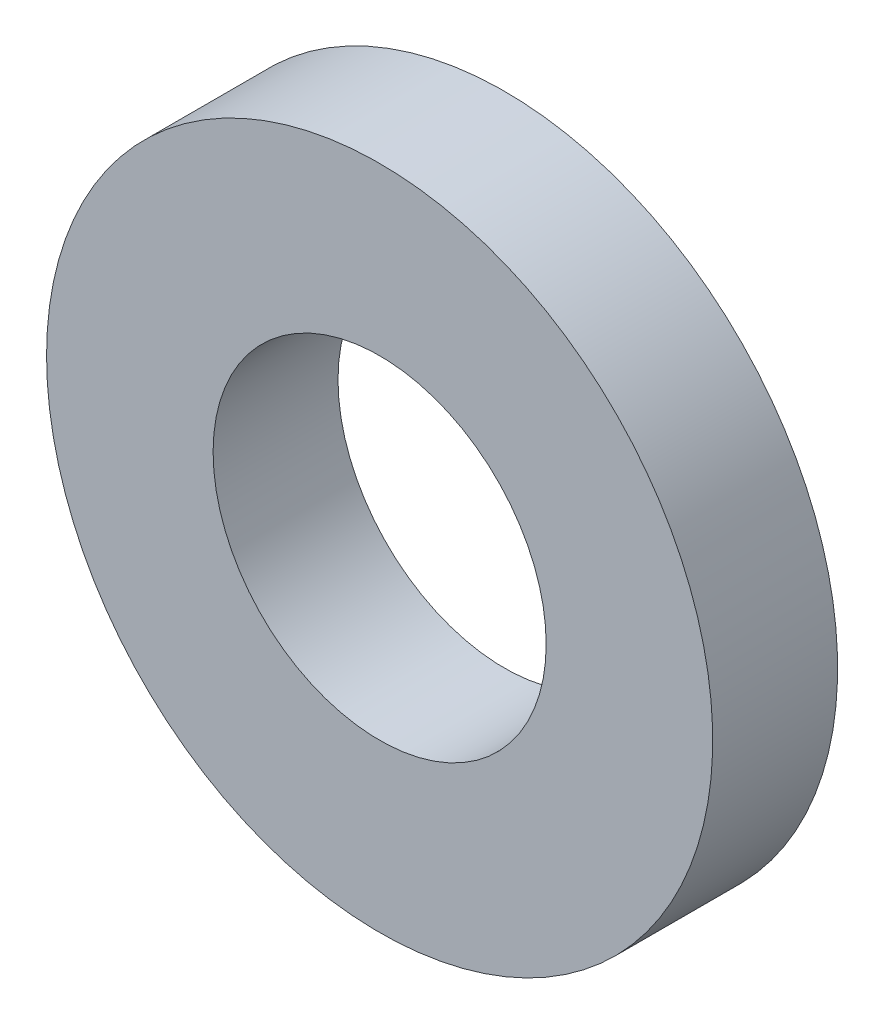
ISO-10303-21;
HEADER;
FILE_DESCRIPTION(('STEP AP214'),'2;1');
FILE_NAME('part.step','',(''),(''),'','','');
FILE_SCHEMA(('AUTOMOTIVE_DESIGN { 1 0 10303 214 1 1 1 1 }'));
ENDSEC;
DATA;
#1=APPLICATION_CONTEXT('core data for automotive mechanical design processes');
#2=APPLICATION_PROTOCOL_DEFINITION('international standard','automotive_design',2000,#1);
#3=PRODUCT_CONTEXT('',#1,'mechanical');
#4=PRODUCT('Part','Part','',(#3));
#5=PRODUCT_RELATED_PRODUCT_CATEGORY('part','',(#4));
#6=PRODUCT_DEFINITION_FORMATION('','',#4);
#7=PRODUCT_DEFINITION_CONTEXT('part definition',#1,'design');
#8=PRODUCT_DEFINITION('design','',#6,#7);
#9=PRODUCT_DEFINITION_SHAPE('','',#8);
#10=(LENGTH_UNIT() NAMED_UNIT(*) SI_UNIT(.MILLI.,.METRE.));
#11=(NAMED_UNIT(*) PLANE_ANGLE_UNIT() SI_UNIT($,.RADIAN.));
#12=(NAMED_UNIT(*) SI_UNIT($,.STERADIAN.) SOLID_ANGLE_UNIT());
#13=UNCERTAINTY_MEASURE_WITH_UNIT(LENGTH_MEASURE(1.E-05),#10,'distance_accuracy_value','');
#14=(GEOMETRIC_REPRESENTATION_CONTEXT(3) GLOBAL_UNCERTAINTY_ASSIGNED_CONTEXT((#13)) GLOBAL_UNIT_ASSIGNED_CONTEXT((#10,
#11,#12)) REPRESENTATION_CONTEXT('',''));
#15=CARTESIAN_POINT('',(0.,0.,0.));
#16=DIRECTION('',(0.,0.,1.));
#17=DIRECTION('',(1.,0.,0.));
#18=AXIS2_PLACEMENT_3D('',#15,#16,#17);
#19=CARTESIAN_POINT('',(0.,0.,2.38125));
#20=DIRECTION('',(0.,0.,1.));
#21=DIRECTION('',(1.,0.,0.));
#22=AXIS2_PLACEMENT_3D('',#19,#20,#21);
#23=PLANE('',#22);
#24=CARTESIAN_POINT('',(0.,0.,2.38125));
#25=DIRECTION('',(0.,0.,1.));
#26=DIRECTION('',(1.,0.,0.));
#27=AXIS2_PLACEMENT_3D('',#24,#25,#26);
#28=CIRCLE('',#27,12.7);
#29=CARTESIAN_POINT('',(-12.7,0.,2.38125));
#30=VERTEX_POINT('',#29);
#31=EDGE_CURVE('E10',#30,#30,#28,.T.);
#32=ORIENTED_EDGE('',*,*,#31,.T.);
#33=EDGE_LOOP('',(#32));
#34=FACE_BOUND('',#33,.T.);
#35=CARTESIAN_POINT('',(0.,0.,2.38125));
#36=DIRECTION('',(0.,0.,1.));
#37=DIRECTION('',(1.,0.,0.));
#38=AXIS2_PLACEMENT_3D('',#35,#36,#37);
#39=CIRCLE('',#38,6.35);
#40=CARTESIAN_POINT('',(-6.35,0.,2.38125));
#41=VERTEX_POINT('',#40);
#42=EDGE_CURVE('E54',#41,#41,#39,.T.);
#43=ORIENTED_EDGE('',*,*,#42,.F.);
#44=EDGE_LOOP('',(#43));
#45=FACE_BOUND('',#44,.T.);
#46=ADVANCED_FACE('F41',(#34,#45),#23,.T.);
#47=CARTESIAN_POINT('',(0.,0.,-2.38125));
#48=DIRECTION('',(0.,0.,1.));
#49=DIRECTION('',(1.,0.,0.));
#50=AXIS2_PLACEMENT_3D('',#47,#48,#49);
#51=PLANE('',#50);
#52=CARTESIAN_POINT('',(0.,0.,-2.38125));
#53=DIRECTION('',(0.,0.,1.));
#54=DIRECTION('',(1.,0.,0.));
#55=AXIS2_PLACEMENT_3D('',#52,#53,#54);
#56=CIRCLE('',#55,12.7);
#57=CARTESIAN_POINT('',(-12.7,0.,-2.38125));
#58=VERTEX_POINT('',#57);
#59=EDGE_CURVE('E45',#58,#58,#56,.T.);
#60=ORIENTED_EDGE('',*,*,#59,.F.);
#61=EDGE_LOOP('',(#60));
#62=FACE_BOUND('',#61,.T.);
#63=CARTESIAN_POINT('',(0.,0.,-2.38125));
#64=DIRECTION('',(0.,0.,1.));
#65=DIRECTION('',(1.,0.,0.));
#66=AXIS2_PLACEMENT_3D('',#63,#64,#65);
#67=CIRCLE('',#66,6.35);
#68=CARTESIAN_POINT('',(-6.35,0.,-2.38125));
#69=VERTEX_POINT('',#68);
#70=EDGE_CURVE('E56',#69,#69,#67,.T.);
#71=ORIENTED_EDGE('',*,*,#70,.T.);
#72=EDGE_LOOP('',(#71));
#73=FACE_BOUND('',#72,.T.);
#74=ADVANCED_FACE('F68',(#62,#73),#51,.F.);
#75=CARTESIAN_POINT('',(0.,0.,2.38125));
#76=DIRECTION('',(0.,0.,-1.));
#77=DIRECTION('',(-1.,0.,0.));
#78=AXIS2_PLACEMENT_3D('',#75,#76,#77);
#79=CYLINDRICAL_SURFACE('',#78,12.7);
#80=CARTESIAN_POINT('',(-12.7,0.,2.38125));
#81=CARTESIAN_POINT('',(-12.7,0.,2.331640625));
#82=CARTESIAN_POINT('',(-12.7,0.,2.28203125));
#83=CARTESIAN_POINT('',(-12.7,0.,2.1828125));
#84=CARTESIAN_POINT('',(-12.7,0.,2.133203125));
#85=CARTESIAN_POINT('',(-12.7,0.,2.033984375));
#86=CARTESIAN_POINT('',(-12.7,0.,1.984375));
#87=CARTESIAN_POINT('',(-12.7,0.,1.88515625));
#88=CARTESIAN_POINT('',(-12.7,0.,1.835546875));
#89=CARTESIAN_POINT('',(-12.7,0.,1.736328125));
#90=CARTESIAN_POINT('',(-12.7,0.,1.68671875));
#91=CARTESIAN_POINT('',(-12.7,0.,1.5875));
#92=CARTESIAN_POINT('',(-12.7,0.,1.537890625));
#93=CARTESIAN_POINT('',(-12.7,0.,1.438671875));
#94=CARTESIAN_POINT('',(-12.7,0.,1.3890625));
#95=CARTESIAN_POINT('',(-12.7,0.,1.28984375));
#96=CARTESIAN_POINT('',(-12.7,0.,1.240234375));
#97=CARTESIAN_POINT('',(-12.7,0.,1.141015625));
#98=CARTESIAN_POINT('',(-12.7,0.,1.09140625));
#99=CARTESIAN_POINT('',(-12.7,0.,0.9921875));
#100=CARTESIAN_POINT('',(-12.7,0.,0.942578125));
#101=CARTESIAN_POINT('',(-12.7,0.,0.843359375));
#102=CARTESIAN_POINT('',(-12.7,0.,0.79375));
#103=CARTESIAN_POINT('',(-12.7,0.,0.69453125));
#104=CARTESIAN_POINT('',(-12.7,0.,0.644921875));
#105=CARTESIAN_POINT('',(-12.7,0.,0.545703125));
#106=CARTESIAN_POINT('',(-12.7,0.,0.49609375));
#107=CARTESIAN_POINT('',(-12.7,0.,0.396875));
#108=CARTESIAN_POINT('',(-12.7,0.,0.347265625));
#109=CARTESIAN_POINT('',(-12.7,0.,0.248046875));
#110=CARTESIAN_POINT('',(-12.7,0.,0.1984375));
#111=CARTESIAN_POINT('',(-12.7,0.,0.09921875));
#112=CARTESIAN_POINT('',(-12.7,0.,0.049609375));
#113=CARTESIAN_POINT('',(-12.7,0.,-0.049609375));
#114=CARTESIAN_POINT('',(-12.7,0.,-0.09921875));
#115=CARTESIAN_POINT('',(-12.7,0.,-0.1984375));
#116=CARTESIAN_POINT('',(-12.7,0.,-0.248046875));
#117=CARTESIAN_POINT('',(-12.7,0.,-0.347265625));
#118=CARTESIAN_POINT('',(-12.7,0.,-0.396875));
#119=CARTESIAN_POINT('',(-12.7,0.,-0.49609375));
#120=CARTESIAN_POINT('',(-12.7,0.,-0.545703125));
#121=CARTESIAN_POINT('',(-12.7,0.,-0.644921875));
#122=CARTESIAN_POINT('',(-12.7,0.,-0.69453125));
#123=CARTESIAN_POINT('',(-12.7,0.,-0.79375));
#124=CARTESIAN_POINT('',(-12.7,0.,-0.843359375));
#125=CARTESIAN_POINT('',(-12.7,0.,-0.942578125));
#126=CARTESIAN_POINT('',(-12.7,0.,-0.9921875));
#127=CARTESIAN_POINT('',(-12.7,0.,-1.09140625));
#128=CARTESIAN_POINT('',(-12.7,0.,-1.141015625));
#129=CARTESIAN_POINT('',(-12.7,0.,-1.240234375));
#130=CARTESIAN_POINT('',(-12.7,0.,-1.28984375));
#131=CARTESIAN_POINT('',(-12.7,0.,-1.3890625));
#132=CARTESIAN_POINT('',(-12.7,0.,-1.438671875));
#133=CARTESIAN_POINT('',(-12.7,0.,-1.537890625));
#134=CARTESIAN_POINT('',(-12.7,0.,-1.5875));
#135=CARTESIAN_POINT('',(-12.7,0.,-1.68671875));
#136=CARTESIAN_POINT('',(-12.7,0.,-1.736328125));
#137=CARTESIAN_POINT('',(-12.7,0.,-1.835546875));
#138=CARTESIAN_POINT('',(-12.7,0.,-1.88515625));
#139=CARTESIAN_POINT('',(-12.7,0.,-1.984375));
#140=CARTESIAN_POINT('',(-12.7,0.,-2.033984375));
#141=CARTESIAN_POINT('',(-12.7,0.,-2.133203125));
#142=CARTESIAN_POINT('',(-12.7,0.,-2.1828125));
#143=CARTESIAN_POINT('',(-12.7,0.,-2.28203125));
#144=CARTESIAN_POINT('',(-12.7,0.,-2.331640625));
#145=CARTESIAN_POINT('',(-12.7,0.,-2.38125));
#146=B_SPLINE_CURVE_WITH_KNOTS('',3,(#80,#81,#82,#83,#84,#85,#86,#87,#88,#89,#90,#91,#92,#93,
#94,#95,#96,#97,#98,#99,#100,#101,#102,#103,#104,#105,#106,#107,#108,#109,#110,#111,#112,#113,
#114,#115,#116,#117,#118,#119,#120,#121,#122,#123,#124,#125,#126,#127,#128,#129,#130,#131,#132,
#133,#134,#135,#136,#137,#138,#139,#140,#141,#142,#143,#144,#145),.UNSPECIFIED.,.F.,.F.,(4,2,2,
2,2,2,2,2,2,2,2,2,2,2,2,2,2,2,2,2,2,2,2,2,2,2,2,2,2,2,2,2,4),(0.,0.148828125,0.29765625,
0.446484375,0.5953125,0.744140625,0.89296875,1.041796875,1.190625,1.339453125,1.48828125,
1.637109375,1.7859375,1.934765625,2.08359375,2.232421875,2.38125,2.530078125,2.67890625,
2.827734375,2.9765625,3.125390625,3.27421875,3.423046875,3.571875,3.720703125,3.86953125,
4.018359375,4.1671875,4.316015625,4.46484375,4.613671875,4.7625),.UNSPECIFIED.);
#147=EDGE_CURVE('BSEAM43',#30,#58,#146,.T.);
#148=ORIENTED_EDGE('',*,*,#31,.F.);
#149=ORIENTED_EDGE('',*,*,#59,.T.);
#150=ORIENTED_EDGE('',*,*,#147,.T.);
#151=ORIENTED_EDGE('',*,*,#147,.F.);
#152=EDGE_LOOP('',(#148,#150,#149,#151));
#153=FACE_BOUND('',#152,.T.);
#154=ADVANCED_FACE('F43',(#153),#79,.T.);
#155=CARTESIAN_POINT('',(0.,0.,2.38125));
#156=DIRECTION('',(0.,0.,-1.));
#157=DIRECTION('',(-1.,0.,0.));
#158=AXIS2_PLACEMENT_3D('',#155,#156,#157);
#159=CYLINDRICAL_SURFACE('',#158,6.35);
#160=CARTESIAN_POINT('',(-6.35,0.,2.38125));
#161=CARTESIAN_POINT('',(-6.35,0.,2.331640625));
#162=CARTESIAN_POINT('',(-6.35,0.,2.28203125));
#163=CARTESIAN_POINT('',(-6.35,0.,2.1828125));
#164=CARTESIAN_POINT('',(-6.35,0.,2.133203125));
#165=CARTESIAN_POINT('',(-6.35,0.,2.033984375));
#166=CARTESIAN_POINT('',(-6.35,0.,1.984375));
#167=CARTESIAN_POINT('',(-6.35,0.,1.88515625));
#168=CARTESIAN_POINT('',(-6.35,0.,1.835546875));
#169=CARTESIAN_POINT('',(-6.35,0.,1.736328125));
#170=CARTESIAN_POINT('',(-6.35,0.,1.68671875));
#171=CARTESIAN_POINT('',(-6.35,0.,1.5875));
#172=CARTESIAN_POINT('',(-6.35,0.,1.537890625));
#173=CARTESIAN_POINT('',(-6.35,0.,1.438671875));
#174=CARTESIAN_POINT('',(-6.35,0.,1.3890625));
#175=CARTESIAN_POINT('',(-6.35,0.,1.28984375));
#176=CARTESIAN_POINT('',(-6.35,0.,1.240234375));
#177=CARTESIAN_POINT('',(-6.35,0.,1.141015625));
#178=CARTESIAN_POINT('',(-6.35,0.,1.09140625));
#179=CARTESIAN_POINT('',(-6.35,0.,0.9921875));
#180=CARTESIAN_POINT('',(-6.35,0.,0.942578125));
#181=CARTESIAN_POINT('',(-6.35,0.,0.843359375));
#182=CARTESIAN_POINT('',(-6.35,0.,0.79375));
#183=CARTESIAN_POINT('',(-6.35,0.,0.69453125));
#184=CARTESIAN_POINT('',(-6.35,0.,0.644921875));
#185=CARTESIAN_POINT('',(-6.35,0.,0.545703125));
#186=CARTESIAN_POINT('',(-6.35,0.,0.49609375));
#187=CARTESIAN_POINT('',(-6.35,0.,0.396875));
#188=CARTESIAN_POINT('',(-6.35,0.,0.347265625));
#189=CARTESIAN_POINT('',(-6.35,0.,0.248046875));
#190=CARTESIAN_POINT('',(-6.35,0.,0.1984375));
#191=CARTESIAN_POINT('',(-6.35,0.,0.0992187499999996));
#192=CARTESIAN_POINT('',(-6.35,0.,0.0496093749999996));
#193=CARTESIAN_POINT('',(-6.35,0.,-0.0496093750000005));
#194=CARTESIAN_POINT('',(-6.35,0.,-0.0992187500000005));
#195=CARTESIAN_POINT('',(-6.35,0.,-0.198437500000001));
#196=CARTESIAN_POINT('',(-6.35,0.,-0.248046875000001));
#197=CARTESIAN_POINT('',(-6.35,0.,-0.347265625000001));
#198=CARTESIAN_POINT('',(-6.35,0.,-0.396875000000001));
#199=CARTESIAN_POINT('',(-6.35,0.,-0.496093750000001));
#200=CARTESIAN_POINT('',(-6.35,0.,-0.545703125000001));
#201=CARTESIAN_POINT('',(-6.35,0.,-0.644921875000001));
#202=CARTESIAN_POINT('',(-6.35,0.,-0.694531250000001));
#203=CARTESIAN_POINT('',(-6.35,0.,-0.793750000000001));
#204=CARTESIAN_POINT('',(-6.35,0.,-0.843359375));
#205=CARTESIAN_POINT('',(-6.35,0.,-0.942578125000001));
#206=CARTESIAN_POINT('',(-6.35,0.,-0.992187500000001));
#207=CARTESIAN_POINT('',(-6.35,0.,-1.09140625));
#208=CARTESIAN_POINT('',(-6.35,0.,-1.141015625));
#209=CARTESIAN_POINT('',(-6.35,0.,-1.240234375));
#210=CARTESIAN_POINT('',(-6.35,0.,-1.28984375));
#211=CARTESIAN_POINT('',(-6.35,0.,-1.3890625));
#212=CARTESIAN_POINT('',(-6.35,0.,-1.438671875));
#213=CARTESIAN_POINT('',(-6.35,0.,-1.537890625));
#214=CARTESIAN_POINT('',(-6.35,0.,-1.5875));
#215=CARTESIAN_POINT('',(-6.35,0.,-1.68671875));
#216=CARTESIAN_POINT('',(-6.35,0.,-1.736328125));
#217=CARTESIAN_POINT('',(-6.35,0.,-1.835546875));
#218=CARTESIAN_POINT('',(-6.35,0.,-1.88515625));
#219=CARTESIAN_POINT('',(-6.35,0.,-1.984375));
#220=CARTESIAN_POINT('',(-6.35,0.,-2.033984375));
#221=CARTESIAN_POINT('',(-6.35,0.,-2.133203125));
#222=CARTESIAN_POINT('',(-6.35,0.,-2.1828125));
#223=CARTESIAN_POINT('',(-6.35,0.,-2.28203125));
#224=CARTESIAN_POINT('',(-6.35,0.,-2.331640625));
#225=CARTESIAN_POINT('',(-6.35,0.,-2.38125));
#226=B_SPLINE_CURVE_WITH_KNOTS('',3,(#160,#161,#162,#163,#164,#165,#166,#167,#168,#169,#170,
#171,#172,#173,#174,#175,#176,#177,#178,#179,#180,#181,#182,#183,#184,#185,#186,#187,#188,#189,
#190,#191,#192,#193,#194,#195,#196,#197,#198,#199,#200,#201,#202,#203,#204,#205,#206,#207,#208,
#209,#210,#211,#212,#213,#214,#215,#216,#217,#218,#219,#220,#221,#222,#223,#224,#225),
.UNSPECIFIED.,.F.,.F.,(4,2,2,2,2,2,2,2,2,2,2,2,2,2,2,2,2,2,2,2,2,2,2,2,2,2,2,2,2,2,2,2,4),(0.,
0.148828125,0.29765625,0.446484375,0.5953125,0.744140625,0.89296875,1.041796875,1.190625,
1.339453125,1.48828125,1.637109375,1.7859375,1.934765625,2.08359375,2.232421875,2.38125,
2.530078125,2.67890625,2.827734375,2.9765625,3.125390625,3.27421875,3.423046875,3.571875,
3.720703125,3.86953125,4.018359375,4.1671875,4.316015625,4.46484375,4.613671875,4.7625),.UNSPECIFIED.);
#227=EDGE_CURVE('BSEAM64',#41,#69,#226,.T.);
#228=ORIENTED_EDGE('',*,*,#42,.T.);
#229=ORIENTED_EDGE('',*,*,#70,.F.);
#230=ORIENTED_EDGE('',*,*,#227,.T.);
#231=ORIENTED_EDGE('',*,*,#227,.F.);
#232=EDGE_LOOP('',(#228,#230,#229,#231));
#233=FACE_BOUND('',#232,.T.);
#234=ADVANCED_FACE('F64',(#233),#159,.F.);
#235=CLOSED_SHELL('',(#46,#74,#154,#234));
#236=MANIFOLD_SOLID_BREP('B2',#235);
#237=ADVANCED_BREP_SHAPE_REPRESENTATION('',(#18,#236),#14);
#238=SHAPE_DEFINITION_REPRESENTATION(#9,#237);
ENDSEC;
END-ISO-10303-21;
